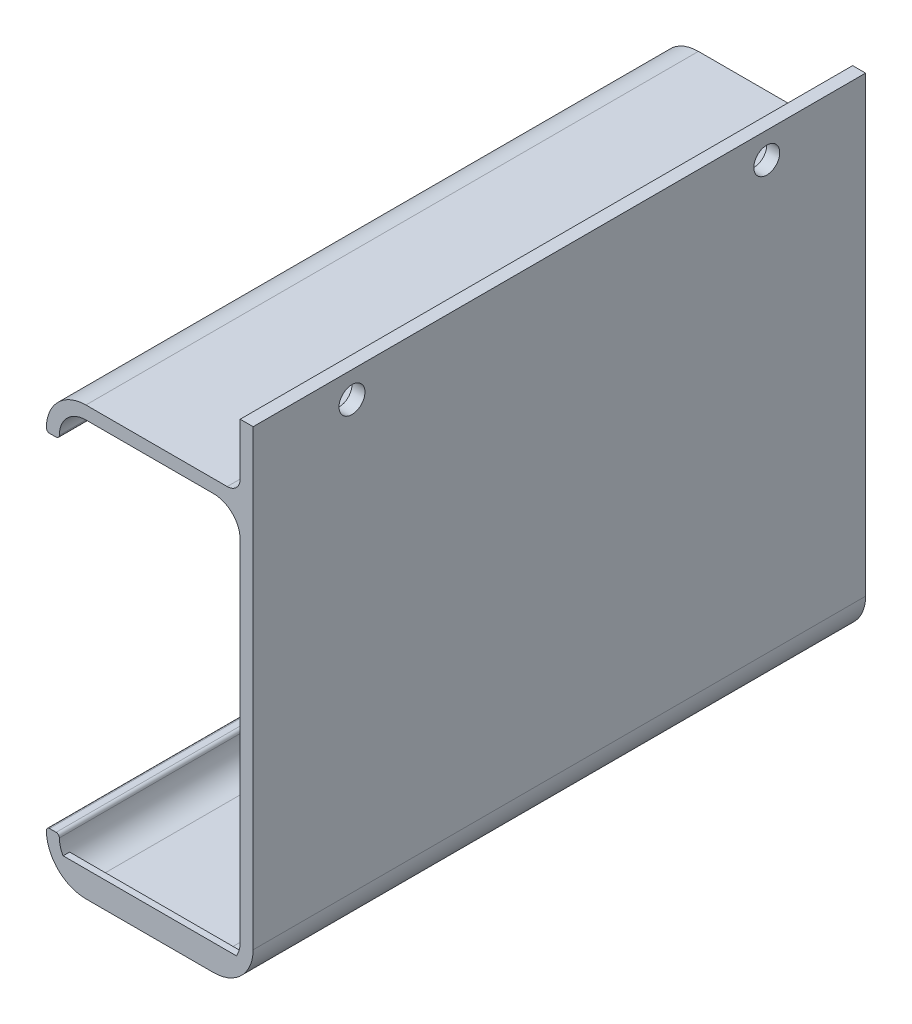
ISO-10303-21;
HEADER;
FILE_DESCRIPTION(('STEP AP214'),'2;1');
FILE_NAME('part.step','',(''),(''),'','','');
FILE_SCHEMA(('AUTOMOTIVE_DESIGN { 1 0 10303 214 1 1 1 1 }'));
ENDSEC;
DATA;
#1=APPLICATION_CONTEXT('core data for automotive mechanical design processes');
#2=APPLICATION_PROTOCOL_DEFINITION('international standard','automotive_design',2000,#1);
#3=PRODUCT_CONTEXT('',#1,'mechanical');
#4=PRODUCT('Part','Part','',(#3));
#5=PRODUCT_RELATED_PRODUCT_CATEGORY('part','',(#4));
#6=PRODUCT_DEFINITION_FORMATION('','',#4);
#7=PRODUCT_DEFINITION_CONTEXT('part definition',#1,'design');
#8=PRODUCT_DEFINITION('design','',#6,#7);
#9=PRODUCT_DEFINITION_SHAPE('','',#8);
#10=(LENGTH_UNIT() NAMED_UNIT(*) SI_UNIT(.MILLI.,.METRE.));
#11=(NAMED_UNIT(*) PLANE_ANGLE_UNIT() SI_UNIT($,.RADIAN.));
#12=(NAMED_UNIT(*) SI_UNIT($,.STERADIAN.) SOLID_ANGLE_UNIT());
#13=UNCERTAINTY_MEASURE_WITH_UNIT(LENGTH_MEASURE(1.E-05),#10,'distance_accuracy_value','');
#14=(GEOMETRIC_REPRESENTATION_CONTEXT(3) GLOBAL_UNCERTAINTY_ASSIGNED_CONTEXT((#13)) GLOBAL_UNIT_ASSIGNED_CONTEXT((#10,
#11,#12)) REPRESENTATION_CONTEXT('',''));
#15=CARTESIAN_POINT('',(0.,0.,0.));
#16=DIRECTION('',(0.,0.,1.));
#17=DIRECTION('',(1.,0.,0.));
#18=AXIS2_PLACEMENT_3D('',#15,#16,#17);
#19=CARTESIAN_POINT('',(-9.85,-26.9,46.25));
#20=DIRECTION('',(0.,0.,-1.));
#21=DIRECTION('',(-1.,0.,0.));
#22=AXIS2_PLACEMENT_3D('',#19,#20,#21);
#23=CYLINDRICAL_SURFACE('',#22,4.09999999999999);
#24=CARTESIAN_POINT('',(-9.85,-26.9,-46.25));
#25=DIRECTION('',(0.,0.,-1.));
#26=DIRECTION('',(-1.,0.,0.));
#27=AXIS2_PLACEMENT_3D('',#24,#25,#26);
#28=CIRCLE('',#27,4.09999999999999);
#29=CARTESIAN_POINT('',(-9.84999999999994,-31.,-46.25));
#30=VERTEX_POINT('',#29);
#31=CARTESIAN_POINT('',(-13.3713633723318,-29.,-46.25));
#32=VERTEX_POINT('',#31);
#33=EDGE_CURVE('E376',#30,#32,#28,.T.);
#34=ORIENTED_EDGE('',*,*,#33,.T.);
#35=DIRECTION('',(0.,0.,1.));
#36=VECTOR('',#35,1.);
#37=CARTESIAN_POINT('',(-13.3713633723318,-29.,-47.25));
#38=LINE('',#37,#36);
#39=CARTESIAN_POINT('',(-13.3713633723318,-29.,-47.25));
#40=VERTEX_POINT('',#39);
#41=EDGE_CURVE('E304',#40,#32,#38,.T.);
#42=ORIENTED_EDGE('',*,*,#41,.F.);
#43=CARTESIAN_POINT('',(-9.85,-26.9,-47.25));
#44=DIRECTION('',(0.,0.,-1.));
#45=DIRECTION('',(1.,0.,0.));
#46=AXIS2_PLACEMENT_3D('',#43,#44,#45);
#47=CIRCLE('',#46,4.09999999999999);
#48=CARTESIAN_POINT('',(-13.95,-26.8999999999999,-47.25));
#49=VERTEX_POINT('',#48);
#50=EDGE_CURVE('E295',#40,#49,#47,.T.);
#51=ORIENTED_EDGE('',*,*,#50,.T.);
#52=DIRECTION('',(0.,0.,-1.));
#53=VECTOR('',#52,1.);
#54=CARTESIAN_POINT('',(-13.95,-26.8999999999999,46.25));
#55=LINE('',#54,#53);
#56=CARTESIAN_POINT('',(-13.95,-26.8999999999999,47.25));
#57=VERTEX_POINT('',#56);
#58=EDGE_CURVE('E421',#57,#49,#55,.T.);
#59=ORIENTED_EDGE('',*,*,#58,.F.);
#60=CARTESIAN_POINT('',(-9.85,-26.9,47.25));
#61=DIRECTION('',(0.,0.,-1.));
#62=DIRECTION('',(1.,0.,0.));
#63=AXIS2_PLACEMENT_3D('',#60,#61,#62);
#64=CIRCLE('',#63,4.09999999999999);
#65=CARTESIAN_POINT('',(-13.3713633723318,-29.,47.25));
#66=VERTEX_POINT('',#65);
#67=EDGE_CURVE('E310',#66,#57,#64,.T.);
#68=ORIENTED_EDGE('',*,*,#67,.F.);
#69=DIRECTION('',(0.,0.,-1.));
#70=VECTOR('',#69,1.);
#71=CARTESIAN_POINT('',(-13.3713633723318,-29.,47.25));
#72=LINE('',#71,#70);
#73=CARTESIAN_POINT('',(-13.3713633723318,-29.,46.25));
#74=VERTEX_POINT('',#73);
#75=EDGE_CURVE('E369',#66,#74,#72,.T.);
#76=ORIENTED_EDGE('',*,*,#75,.T.);
#77=CARTESIAN_POINT('',(-9.85,-26.9,46.25));
#78=DIRECTION('',(0.,0.,-1.));
#79=DIRECTION('',(-1.,0.,0.));
#80=AXIS2_PLACEMENT_3D('',#77,#78,#79);
#81=CIRCLE('',#80,4.09999999999999);
#82=CARTESIAN_POINT('',(-9.84999999999994,-31.,46.25));
#83=VERTEX_POINT('',#82);
#84=EDGE_CURVE('E54',#83,#74,#81,.T.);
#85=ORIENTED_EDGE('',*,*,#84,.F.);
#86=DIRECTION('',(0.,0.,-1.));
#87=VECTOR('',#86,1.);
#88=CARTESIAN_POINT('',(-9.84999999999994,-31.,46.25));
#89=LINE('',#88,#87);
#90=EDGE_CURVE('E382',#83,#30,#89,.T.);
#91=ORIENTED_EDGE('',*,*,#90,.T.);
#92=EDGE_LOOP('',(#34,#42,#51,#59,#68,#76,#85,#91));
#93=FACE_BOUND('',#92,.T.);
#94=ADVANCED_FACE('F39',(#93),#23,.F.);
#95=CARTESIAN_POINT('',(-15.95,-26.4,46.25));
#96=DIRECTION('',(0.,-1.,0.));
#97=DIRECTION('',(0.,0.,-1.));
#98=AXIS2_PLACEMENT_3D('',#95,#96,#97);
#99=PLANE('',#98);
#100=DIRECTION('',(0.,0.,-1.));
#101=VECTOR('',#100,1.);
#102=CARTESIAN_POINT('',(-15.45,-26.4,46.25));
#103=LINE('',#102,#101);
#104=CARTESIAN_POINT('',(-15.45,-26.4,-47.25));
#105=VERTEX_POINT('',#104);
#106=CARTESIAN_POINT('',(-15.45,-26.4,47.25));
#107=VERTEX_POINT('',#106);
#108=EDGE_CURVE('E47',#105,#107,#103,.F.);
#109=ORIENTED_EDGE('',*,*,#108,.T.);
#110=DIRECTION('',(-1.,0.,0.));
#111=VECTOR('',#110,1.);
#112=CARTESIAN_POINT('',(-14.45,-26.4,47.25));
#113=LINE('',#112,#111);
#114=CARTESIAN_POINT('',(-14.45,-26.4,47.25));
#115=VERTEX_POINT('',#114);
#116=EDGE_CURVE('E316',#115,#107,#113,.T.);
#117=ORIENTED_EDGE('',*,*,#116,.F.);
#118=DIRECTION('',(0.,0.,-1.));
#119=VECTOR('',#118,1.);
#120=CARTESIAN_POINT('',(-14.45,-26.4,46.25));
#121=LINE('',#120,#119);
#122=CARTESIAN_POINT('',(-14.45,-26.4,-47.25));
#123=VERTEX_POINT('',#122);
#124=EDGE_CURVE('E11',#115,#123,#121,.T.);
#125=ORIENTED_EDGE('',*,*,#124,.T.);
#126=DIRECTION('',(-1.,0.,0.));
#127=VECTOR('',#126,1.);
#128=CARTESIAN_POINT('',(-14.45,-26.4,-47.25));
#129=LINE('',#128,#127);
#130=EDGE_CURVE('E289',#123,#105,#129,.T.);
#131=ORIENTED_EDGE('',*,*,#130,.T.);
#132=EDGE_LOOP('',(#109,#117,#125,#131));
#133=FACE_BOUND('',#132,.T.);
#134=ADVANCED_FACE('F428',(#133),#99,.F.);
#135=CARTESIAN_POINT('',(-9.85,-26.9,46.25));
#136=DIRECTION('',(0.,0.,-1.));
#137=DIRECTION('',(-1.,0.,0.));
#138=AXIS2_PLACEMENT_3D('',#135,#136,#137);
#139=CYLINDRICAL_SURFACE('',#138,6.1);
#140=DIRECTION('',(0.,0.,-1.));
#141=VECTOR('',#140,1.);
#142=CARTESIAN_POINT('',(-15.95,-26.8999999999999,46.25));
#143=LINE('',#142,#141);
#144=CARTESIAN_POINT('',(-15.95,-26.8999999999999,47.25));
#145=VERTEX_POINT('',#144);
#146=CARTESIAN_POINT('',(-15.95,-26.8999999999999,-47.25));
#147=VERTEX_POINT('',#146);
#148=EDGE_CURVE('E419',#145,#147,#143,.T.);
#149=ORIENTED_EDGE('',*,*,#148,.T.);
#150=CARTESIAN_POINT('',(-9.85,-26.9,-47.25));
#151=DIRECTION('',(0.,0.,1.));
#152=DIRECTION('',(1.,0.,0.));
#153=AXIS2_PLACEMENT_3D('',#150,#151,#152);
#154=CIRCLE('',#153,6.1);
#155=CARTESIAN_POINT('',(-9.84999999999994,-33.,-47.25));
#156=VERTEX_POINT('',#155);
#157=EDGE_CURVE('E283',#147,#156,#154,.T.);
#158=ORIENTED_EDGE('',*,*,#157,.T.);
#159=DIRECTION('',(0.,0.,-1.));
#160=VECTOR('',#159,1.);
#161=CARTESIAN_POINT('',(-9.84999999999994,-33.,46.25));
#162=LINE('',#161,#160);
#163=CARTESIAN_POINT('',(-9.84999999999994,-33.,47.25));
#164=VERTEX_POINT('',#163);
#165=EDGE_CURVE('E417',#164,#156,#162,.T.);
#166=ORIENTED_EDGE('',*,*,#165,.F.);
#167=CARTESIAN_POINT('',(-9.85,-26.9,47.25));
#168=DIRECTION('',(0.,0.,1.));
#169=DIRECTION('',(1.,0.,0.));
#170=AXIS2_PLACEMENT_3D('',#167,#168,#169);
#171=CIRCLE('',#170,6.1);
#172=EDGE_CURVE('E322',#145,#164,#171,.T.);
#173=ORIENTED_EDGE('',*,*,#172,.F.);
#174=EDGE_LOOP('',(#149,#158,#166,#173));
#175=FACE_BOUND('',#174,.T.);
#176=ADVANCED_FACE('F439',(#175),#139,.T.);
#177=CARTESIAN_POINT('',(9.84999999999991,-33.,46.25));
#178=DIRECTION('',(0.,1.,0.));
#179=DIRECTION('',(0.,0.,1.));
#180=AXIS2_PLACEMENT_3D('',#177,#178,#179);
#181=PLANE('',#180);
#182=ORIENTED_EDGE('',*,*,#165,.T.);
#183=DIRECTION('',(1.,0.,0.));
#184=VECTOR('',#183,1.);
#185=CARTESIAN_POINT('',(-9.84999999999994,-33.,-47.25));
#186=LINE('',#185,#184);
#187=CARTESIAN_POINT('',(9.84999999999991,-33.,-47.25));
#188=VERTEX_POINT('',#187);
#189=EDGE_CURVE('E280',#156,#188,#186,.T.);
#190=ORIENTED_EDGE('',*,*,#189,.T.);
#191=DIRECTION('',(0.,0.,-1.));
#192=VECTOR('',#191,1.);
#193=CARTESIAN_POINT('',(9.84999999999991,-33.,46.25));
#194=LINE('',#193,#192);
#195=CARTESIAN_POINT('',(9.84999999999991,-33.,47.25));
#196=VERTEX_POINT('',#195);
#197=EDGE_CURVE('E415',#196,#188,#194,.T.);
#198=ORIENTED_EDGE('',*,*,#197,.F.);
#199=DIRECTION('',(1.,0.,0.));
#200=VECTOR('',#199,1.);
#201=CARTESIAN_POINT('',(-9.84999999999994,-33.,47.25));
#202=LINE('',#201,#200);
#203=EDGE_CURVE('E325',#164,#196,#202,.T.);
#204=ORIENTED_EDGE('',*,*,#203,.F.);
#205=EDGE_LOOP('',(#182,#190,#198,#204));
#206=FACE_BOUND('',#205,.T.);
#207=ADVANCED_FACE('F444',(#206),#181,.F.);
#208=CARTESIAN_POINT('',(9.85,-26.9,46.25));
#209=DIRECTION('',(0.,0.,-1.));
#210=DIRECTION('',(-1.,0.,0.));
#211=AXIS2_PLACEMENT_3D('',#208,#209,#210);
#212=CYLINDRICAL_SURFACE('',#211,6.1);
#213=ORIENTED_EDGE('',*,*,#197,.T.);
#214=CARTESIAN_POINT('',(9.85,-26.9,-47.25));
#215=DIRECTION('',(0.,0.,1.));
#216=DIRECTION('',(1.,0.,0.));
#217=AXIS2_PLACEMENT_3D('',#214,#215,#216);
#218=CIRCLE('',#217,6.1);
#219=CARTESIAN_POINT('',(15.95,-26.9,-47.25));
#220=VERTEX_POINT('',#219);
#221=EDGE_CURVE('E277',#188,#220,#218,.T.);
#222=ORIENTED_EDGE('',*,*,#221,.T.);
#223=DIRECTION('',(0.,0.,-1.));
#224=VECTOR('',#223,1.);
#225=CARTESIAN_POINT('',(15.95,-26.8999999999999,46.25));
#226=LINE('',#225,#224);
#227=CARTESIAN_POINT('',(15.95,-26.9,47.25));
#228=VERTEX_POINT('',#227);
#229=EDGE_CURVE('E413',#228,#220,#226,.T.);
#230=ORIENTED_EDGE('',*,*,#229,.F.);
#231=CARTESIAN_POINT('',(9.85,-26.9,47.25));
#232=DIRECTION('',(0.,0.,1.));
#233=DIRECTION('',(1.,0.,0.));
#234=AXIS2_PLACEMENT_3D('',#231,#232,#233);
#235=CIRCLE('',#234,6.1);
#236=EDGE_CURVE('E328',#196,#228,#235,.T.);
#237=ORIENTED_EDGE('',*,*,#236,.F.);
#238=EDGE_LOOP('',(#213,#222,#230,#237));
#239=FACE_BOUND('',#238,.T.);
#240=ADVANCED_FACE('F449',(#239),#212,.T.);
#241=CARTESIAN_POINT('',(15.95,26.8999999999999,46.25));
#242=DIRECTION('',(-1.,0.,0.));
#243=DIRECTION('',(0.,0.,1.));
#244=AXIS2_PLACEMENT_3D('',#241,#242,#243);
#245=PLANE('',#244);
#246=CARTESIAN_POINT('',(15.95,39.,32.));
#247=DIRECTION('',(-1.,0.,0.));
#248=DIRECTION('',(0.,0.,1.));
#249=AXIS2_PLACEMENT_3D('',#246,#247,#248);
#250=CIRCLE('',#249,2.);
#251=CARTESIAN_POINT('',(15.95,39.,34.));
#252=VERTEX_POINT('',#251);
#253=EDGE_CURVE('E302',#252,#252,#250,.T.);
#254=ORIENTED_EDGE('',*,*,#253,.T.);
#255=EDGE_LOOP('',(#254));
#256=FACE_BOUND('',#255,.T.);
#257=CARTESIAN_POINT('',(15.95,39.,-32.));
#258=DIRECTION('',(-1.,0.,0.));
#259=DIRECTION('',(0.,0.,1.));
#260=AXIS2_PLACEMENT_3D('',#257,#258,#259);
#261=CIRCLE('',#260,2.);
#262=CARTESIAN_POINT('',(15.95,39.,-30.));
#263=VERTEX_POINT('',#262);
#264=EDGE_CURVE('E643',#263,#263,#261,.T.);
#265=ORIENTED_EDGE('',*,*,#264,.T.);
#266=EDGE_LOOP('',(#265));
#267=FACE_BOUND('',#266,.T.);
#268=ORIENTED_EDGE('',*,*,#229,.T.);
#269=DIRECTION('',(0.,1.,0.));
#270=VECTOR('',#269,1.);
#271=CARTESIAN_POINT('',(15.95,-26.9,-47.25));
#272=LINE('',#271,#270);
#273=CARTESIAN_POINT('',(15.95,43.,-47.25));
#274=VERTEX_POINT('',#273);
#275=EDGE_CURVE('E274',#220,#274,#272,.T.);
#276=ORIENTED_EDGE('',*,*,#275,.T.);
#277=DIRECTION('',(0.,0.,-1.));
#278=VECTOR('',#277,1.);
#279=CARTESIAN_POINT('',(15.95,43.,46.25));
#280=LINE('',#279,#278);
#281=CARTESIAN_POINT('',(15.95,43.,47.25));
#282=VERTEX_POINT('',#281);
#283=EDGE_CURVE('E411',#282,#274,#280,.T.);
#284=ORIENTED_EDGE('',*,*,#283,.F.);
#285=DIRECTION('',(0.,1.,0.));
#286=VECTOR('',#285,1.);
#287=CARTESIAN_POINT('',(15.95,-26.9,47.25));
#288=LINE('',#287,#286);
#289=EDGE_CURVE('E331',#228,#282,#288,.T.);
#290=ORIENTED_EDGE('',*,*,#289,.F.);
#291=EDGE_LOOP('',(#268,#276,#284,#290));
#292=FACE_BOUND('',#291,.T.);
#293=ADVANCED_FACE('F451',(#256,#267,#292),#245,.F.);
#294=CARTESIAN_POINT('',(13.95,43.,46.25));
#295=DIRECTION('',(0.,-1.,0.));
#296=DIRECTION('',(1.,0.,0.));
#297=AXIS2_PLACEMENT_3D('',#294,#295,#296);
#298=PLANE('',#297);
#299=ORIENTED_EDGE('',*,*,#283,.T.);
#300=DIRECTION('',(-1.,0.,0.));
#301=VECTOR('',#300,1.);
#302=CARTESIAN_POINT('',(15.95,43.,-47.25));
#303=LINE('',#302,#301);
#304=CARTESIAN_POINT('',(13.95,43.,-47.25));
#305=VERTEX_POINT('',#304);
#306=EDGE_CURVE('E271',#274,#305,#303,.T.);
#307=ORIENTED_EDGE('',*,*,#306,.T.);
#308=DIRECTION('',(0.,0.,-1.));
#309=VECTOR('',#308,1.);
#310=CARTESIAN_POINT('',(13.95,43.,46.25));
#311=LINE('',#310,#309);
#312=CARTESIAN_POINT('',(13.95,43.,47.25));
#313=VERTEX_POINT('',#312);
#314=EDGE_CURVE('E409',#313,#305,#311,.T.);
#315=ORIENTED_EDGE('',*,*,#314,.F.);
#316=DIRECTION('',(-1.,0.,0.));
#317=VECTOR('',#316,1.);
#318=CARTESIAN_POINT('',(15.95,43.,47.25));
#319=LINE('',#318,#317);
#320=EDGE_CURVE('E334',#282,#313,#319,.T.);
#321=ORIENTED_EDGE('',*,*,#320,.F.);
#322=EDGE_LOOP('',(#299,#307,#315,#321));
#323=FACE_BOUND('',#322,.T.);
#324=ADVANCED_FACE('F456',(#323),#298,.F.);
#325=CARTESIAN_POINT('',(13.95,35.,46.25));
#326=DIRECTION('',(1.,0.,0.));
#327=DIRECTION('',(0.,0.,-1.));
#328=AXIS2_PLACEMENT_3D('',#325,#326,#327);
#329=PLANE('',#328);
#330=CARTESIAN_POINT('',(13.95,39.,32.));
#331=DIRECTION('',(-1.,0.,0.));
#332=DIRECTION('',(0.,0.,1.));
#333=AXIS2_PLACEMENT_3D('',#330,#331,#332);
#334=CIRCLE('',#333,2.);
#335=CARTESIAN_POINT('',(13.95,39.,34.));
#336=VERTEX_POINT('',#335);
#337=EDGE_CURVE('E639',#336,#336,#334,.T.);
#338=ORIENTED_EDGE('',*,*,#337,.F.);
#339=EDGE_LOOP('',(#338));
#340=FACE_BOUND('',#339,.T.);
#341=CARTESIAN_POINT('',(13.95,39.,-32.));
#342=DIRECTION('',(-1.,0.,0.));
#343=DIRECTION('',(0.,0.,-1.));
#344=AXIS2_PLACEMENT_3D('',#341,#342,#343);
#345=CIRCLE('',#344,2.);
#346=CARTESIAN_POINT('',(13.95,39.,-34.));
#347=VERTEX_POINT('',#346);
#348=EDGE_CURVE('E647',#347,#347,#345,.T.);
#349=ORIENTED_EDGE('',*,*,#348,.F.);
#350=EDGE_LOOP('',(#349));
#351=FACE_BOUND('',#350,.T.);
#352=ORIENTED_EDGE('',*,*,#314,.T.);
#353=DIRECTION('',(0.,-1.,0.));
#354=VECTOR('',#353,1.);
#355=CARTESIAN_POINT('',(13.95,43.,-47.25));
#356=LINE('',#355,#354);
#357=CARTESIAN_POINT('',(13.95,35.,-47.25));
#358=VERTEX_POINT('',#357);
#359=EDGE_CURVE('E268',#305,#358,#356,.T.);
#360=ORIENTED_EDGE('',*,*,#359,.T.);
#361=DIRECTION('',(0.,0.,-1.));
#362=VECTOR('',#361,1.);
#363=CARTESIAN_POINT('',(13.95,35.,46.25));
#364=LINE('',#363,#362);
#365=CARTESIAN_POINT('',(13.95,35.,47.25));
#366=VERTEX_POINT('',#365);
#367=EDGE_CURVE('E407',#366,#358,#364,.T.);
#368=ORIENTED_EDGE('',*,*,#367,.F.);
#369=DIRECTION('',(0.,-1.,0.));
#370=VECTOR('',#369,1.);
#371=CARTESIAN_POINT('',(13.95,43.,47.25));
#372=LINE('',#371,#370);
#373=EDGE_CURVE('E337',#313,#366,#372,.T.);
#374=ORIENTED_EDGE('',*,*,#373,.F.);
#375=EDGE_LOOP('',(#352,#360,#368,#374));
#376=FACE_BOUND('',#375,.T.);
#377=ADVANCED_FACE('F461',(#340,#351,#376),#329,.F.);
#378=CARTESIAN_POINT('',(11.95,35.,46.25));
#379=DIRECTION('',(0.,0.,-1.));
#380=DIRECTION('',(-1.,0.,0.));
#381=AXIS2_PLACEMENT_3D('',#378,#379,#380);
#382=CYLINDRICAL_SURFACE('',#381,2.);
#383=ORIENTED_EDGE('',*,*,#367,.T.);
#384=CARTESIAN_POINT('',(11.95,35.,-47.25));
#385=DIRECTION('',(0.,0.,-1.));
#386=DIRECTION('',(1.,0.,0.));
#387=AXIS2_PLACEMENT_3D('',#384,#385,#386);
#388=CIRCLE('',#387,2.);
#389=CARTESIAN_POINT('',(11.95,33.,-47.25));
#390=VERTEX_POINT('',#389);
#391=EDGE_CURVE('E265',#358,#390,#388,.T.);
#392=ORIENTED_EDGE('',*,*,#391,.T.);
#393=DIRECTION('',(0.,0.,-1.));
#394=VECTOR('',#393,1.);
#395=CARTESIAN_POINT('',(11.95,33.,46.25));
#396=LINE('',#395,#394);
#397=CARTESIAN_POINT('',(11.95,33.,47.25));
#398=VERTEX_POINT('',#397);
#399=EDGE_CURVE('E405',#398,#390,#396,.T.);
#400=ORIENTED_EDGE('',*,*,#399,.F.);
#401=CARTESIAN_POINT('',(11.95,35.,47.25));
#402=DIRECTION('',(0.,0.,-1.));
#403=DIRECTION('',(1.,0.,0.));
#404=AXIS2_PLACEMENT_3D('',#401,#402,#403);
#405=CIRCLE('',#404,2.);
#406=EDGE_CURVE('E340',#366,#398,#405,.T.);
#407=ORIENTED_EDGE('',*,*,#406,.F.);
#408=EDGE_LOOP('',(#383,#392,#400,#407));
#409=FACE_BOUND('',#408,.T.);
#410=ADVANCED_FACE('F463',(#409),#382,.F.);
#411=CARTESIAN_POINT('',(9.84999999999994,33.,46.25));
#412=DIRECTION('',(0.,-1.,0.));
#413=DIRECTION('',(0.,0.,-1.));
#414=AXIS2_PLACEMENT_3D('',#411,#412,#413);
#415=PLANE('',#414);
#416=ORIENTED_EDGE('',*,*,#399,.T.);
#417=DIRECTION('',(-1.,0.,0.));
#418=VECTOR('',#417,1.);
#419=CARTESIAN_POINT('',(11.95,33.,-47.25));
#420=LINE('',#419,#418);
#421=CARTESIAN_POINT('',(-9.84999999999992,33.,-47.25));
#422=VERTEX_POINT('',#421);
#423=EDGE_CURVE('E262',#390,#422,#420,.T.);
#424=ORIENTED_EDGE('',*,*,#423,.T.);
#425=DIRECTION('',(0.,0.,-1.));
#426=VECTOR('',#425,1.);
#427=CARTESIAN_POINT('',(-9.84999999999992,33.,46.25));
#428=LINE('',#427,#426);
#429=CARTESIAN_POINT('',(-9.84999999999992,33.,47.25));
#430=VERTEX_POINT('',#429);
#431=EDGE_CURVE('E403',#430,#422,#428,.T.);
#432=ORIENTED_EDGE('',*,*,#431,.F.);
#433=DIRECTION('',(-1.,0.,0.));
#434=VECTOR('',#433,1.);
#435=CARTESIAN_POINT('',(11.95,33.,47.25));
#436=LINE('',#435,#434);
#437=EDGE_CURVE('E343',#398,#430,#436,.T.);
#438=ORIENTED_EDGE('',*,*,#437,.F.);
#439=EDGE_LOOP('',(#416,#424,#432,#438));
#440=FACE_BOUND('',#439,.T.);
#441=ADVANCED_FACE('F468',(#440),#415,.F.);
#442=CARTESIAN_POINT('',(-9.85,26.9,46.25));
#443=DIRECTION('',(0.,0.,-1.));
#444=DIRECTION('',(-1.,0.,0.));
#445=AXIS2_PLACEMENT_3D('',#442,#443,#444);
#446=CYLINDRICAL_SURFACE('',#445,6.1);
#447=ORIENTED_EDGE('',*,*,#431,.T.);
#448=CARTESIAN_POINT('',(-9.85,26.9,-47.25));
#449=DIRECTION('',(0.,0.,1.));
#450=DIRECTION('',(1.,0.,0.));
#451=AXIS2_PLACEMENT_3D('',#448,#449,#450);
#452=CIRCLE('',#451,6.1);
#453=CARTESIAN_POINT('',(-15.95,26.9,-47.25));
#454=VERTEX_POINT('',#453);
#455=EDGE_CURVE('E259',#422,#454,#452,.T.);
#456=ORIENTED_EDGE('',*,*,#455,.T.);
#457=DIRECTION('',(0.,0.,-1.));
#458=VECTOR('',#457,1.);
#459=CARTESIAN_POINT('',(-15.95,26.9,46.25));
#460=LINE('',#459,#458);
#461=CARTESIAN_POINT('',(-15.95,26.9,47.25));
#462=VERTEX_POINT('',#461);
#463=EDGE_CURVE('E401',#462,#454,#460,.T.);
#464=ORIENTED_EDGE('',*,*,#463,.F.);
#465=CARTESIAN_POINT('',(-9.85,26.9,47.25));
#466=DIRECTION('',(0.,0.,1.));
#467=DIRECTION('',(1.,0.,0.));
#468=AXIS2_PLACEMENT_3D('',#465,#466,#467);
#469=CIRCLE('',#468,6.1);
#470=EDGE_CURVE('E346',#430,#462,#469,.T.);
#471=ORIENTED_EDGE('',*,*,#470,.F.);
#472=EDGE_LOOP('',(#447,#456,#464,#471));
#473=FACE_BOUND('',#472,.T.);
#474=ADVANCED_FACE('F473',(#473),#446,.T.);
#475=CARTESIAN_POINT('',(-15.95,26.4,46.25));
#476=DIRECTION('',(0.,1.,0.));
#477=DIRECTION('',(0.,0.,1.));
#478=AXIS2_PLACEMENT_3D('',#475,#476,#477);
#479=PLANE('',#478);
#480=DIRECTION('',(0.,0.,-1.));
#481=VECTOR('',#480,1.);
#482=CARTESIAN_POINT('',(-14.45,26.4,46.25));
#483=LINE('',#482,#481);
#484=CARTESIAN_POINT('',(-14.45,26.4,-47.25));
#485=VERTEX_POINT('',#484);
#486=CARTESIAN_POINT('',(-14.45,26.4,47.25));
#487=VERTEX_POINT('',#486);
#488=EDGE_CURVE('E423',#485,#487,#483,.F.);
#489=ORIENTED_EDGE('',*,*,#488,.T.);
#490=DIRECTION('',(1.,0.,0.));
#491=VECTOR('',#490,1.);
#492=CARTESIAN_POINT('',(-15.45,26.4,47.25));
#493=LINE('',#492,#491);
#494=CARTESIAN_POINT('',(-15.45,26.4,47.25));
#495=VERTEX_POINT('',#494);
#496=EDGE_CURVE('E352',#495,#487,#493,.T.);
#497=ORIENTED_EDGE('',*,*,#496,.F.);
#498=DIRECTION('',(0.,0.,-1.));
#499=VECTOR('',#498,1.);
#500=CARTESIAN_POINT('',(-15.45,26.4,46.25));
#501=LINE('',#500,#499);
#502=CARTESIAN_POINT('',(-15.45,26.4,-47.25));
#503=VERTEX_POINT('',#502);
#504=EDGE_CURVE('E425',#495,#503,#501,.T.);
#505=ORIENTED_EDGE('',*,*,#504,.T.);
#506=DIRECTION('',(1.,0.,0.));
#507=VECTOR('',#506,1.);
#508=CARTESIAN_POINT('',(-15.45,26.4,-47.25));
#509=LINE('',#508,#507);
#510=EDGE_CURVE('E253',#503,#485,#509,.T.);
#511=ORIENTED_EDGE('',*,*,#510,.T.);
#512=EDGE_LOOP('',(#489,#497,#505,#511));
#513=FACE_BOUND('',#512,.T.);
#514=ADVANCED_FACE('F480',(#513),#479,.F.);
#515=CARTESIAN_POINT('',(-9.85,26.9,46.25));
#516=DIRECTION('',(0.,0.,-1.));
#517=DIRECTION('',(-1.,0.,0.));
#518=AXIS2_PLACEMENT_3D('',#515,#516,#517);
#519=CYLINDRICAL_SURFACE('',#518,4.09999999999999);
#520=DIRECTION('',(0.,0.,-1.));
#521=VECTOR('',#520,1.);
#522=CARTESIAN_POINT('',(-13.95,26.9,46.25));
#523=LINE('',#522,#521);
#524=CARTESIAN_POINT('',(-13.95,26.9,47.25));
#525=VERTEX_POINT('',#524);
#526=CARTESIAN_POINT('',(-13.95,26.9,-47.25));
#527=VERTEX_POINT('',#526);
#528=EDGE_CURVE('E399',#525,#527,#523,.T.);
#529=ORIENTED_EDGE('',*,*,#528,.T.);
#530=CARTESIAN_POINT('',(-9.85,26.9,-47.25));
#531=DIRECTION('',(0.,0.,-1.));
#532=DIRECTION('',(1.,0.,0.));
#533=AXIS2_PLACEMENT_3D('',#530,#531,#532);
#534=CIRCLE('',#533,4.1);
#535=CARTESIAN_POINT('',(-9.84999999999995,31.,-47.25));
#536=VERTEX_POINT('',#535);
#537=EDGE_CURVE('E247',#527,#536,#534,.T.);
#538=ORIENTED_EDGE('',*,*,#537,.T.);
#539=DIRECTION('',(0.,0.,-1.));
#540=VECTOR('',#539,1.);
#541=CARTESIAN_POINT('',(-9.84999999999995,31.,46.25));
#542=LINE('',#541,#540);
#543=CARTESIAN_POINT('',(-9.84999999999995,31.,47.25));
#544=VERTEX_POINT('',#543);
#545=EDGE_CURVE('E397',#544,#536,#542,.T.);
#546=ORIENTED_EDGE('',*,*,#545,.F.);
#547=CARTESIAN_POINT('',(-9.85,26.9,47.25));
#548=DIRECTION('',(0.,0.,-1.));
#549=DIRECTION('',(1.,0.,0.));
#550=AXIS2_PLACEMENT_3D('',#547,#548,#549);
#551=CIRCLE('',#550,4.1);
#552=EDGE_CURVE('E358',#525,#544,#551,.T.);
#553=ORIENTED_EDGE('',*,*,#552,.F.);
#554=EDGE_LOOP('',(#529,#538,#546,#553));
#555=FACE_BOUND('',#554,.T.);
#556=ADVANCED_FACE('F487',(#555),#519,.F.);
#557=CARTESIAN_POINT('',(9.84999999999994,31.,46.25));
#558=DIRECTION('',(0.,1.,0.));
#559=DIRECTION('',(-1.,0.,0.));
#560=AXIS2_PLACEMENT_3D('',#557,#558,#559);
#561=PLANE('',#560);
#562=ORIENTED_EDGE('',*,*,#545,.T.);
#563=DIRECTION('',(1.,0.,0.));
#564=VECTOR('',#563,1.);
#565=CARTESIAN_POINT('',(-9.84999999999995,31.,-47.25));
#566=LINE('',#565,#564);
#567=CARTESIAN_POINT('',(9.84999999999994,31.,-47.25));
#568=VERTEX_POINT('',#567);
#569=EDGE_CURVE('E241',#536,#568,#566,.T.);
#570=ORIENTED_EDGE('',*,*,#569,.T.);
#571=DIRECTION('',(0.,0.,-1.));
#572=VECTOR('',#571,1.);
#573=CARTESIAN_POINT('',(9.84999999999994,31.,46.25));
#574=LINE('',#573,#572);
#575=CARTESIAN_POINT('',(9.84999999999994,31.,47.25));
#576=VERTEX_POINT('',#575);
#577=EDGE_CURVE('E395',#576,#568,#574,.T.);
#578=ORIENTED_EDGE('',*,*,#577,.F.);
#579=DIRECTION('',(1.,0.,0.));
#580=VECTOR('',#579,1.);
#581=CARTESIAN_POINT('',(-9.84999999999995,31.,47.25));
#582=LINE('',#581,#580);
#583=EDGE_CURVE('E361',#544,#576,#582,.T.);
#584=ORIENTED_EDGE('',*,*,#583,.F.);
#585=EDGE_LOOP('',(#562,#570,#578,#584));
#586=FACE_BOUND('',#585,.T.);
#587=ADVANCED_FACE('F490',(#586),#561,.F.);
#588=CARTESIAN_POINT('',(9.85,26.9,46.25));
#589=DIRECTION('',(0.,0.,-1.));
#590=DIRECTION('',(-1.,0.,0.));
#591=AXIS2_PLACEMENT_3D('',#588,#589,#590);
#592=CYLINDRICAL_SURFACE('',#591,4.10000000000001);
#593=ORIENTED_EDGE('',*,*,#577,.T.);
#594=CARTESIAN_POINT('',(9.85,26.9,-47.25));
#595=DIRECTION('',(0.,0.,-1.));
#596=DIRECTION('',(1.,0.,0.));
#597=AXIS2_PLACEMENT_3D('',#594,#595,#596);
#598=CIRCLE('',#597,4.10000000000001);
#599=CARTESIAN_POINT('',(13.95,26.8999999999999,-47.25));
#600=VERTEX_POINT('',#599);
#601=EDGE_CURVE('E239',#568,#600,#598,.T.);
#602=ORIENTED_EDGE('',*,*,#601,.T.);
#603=DIRECTION('',(0.,0.,-1.));
#604=VECTOR('',#603,1.);
#605=CARTESIAN_POINT('',(13.95,26.8999999999999,46.25));
#606=LINE('',#605,#604);
#607=CARTESIAN_POINT('',(13.95,26.8999999999999,47.25));
#608=VERTEX_POINT('',#607);
#609=EDGE_CURVE('E224',#608,#600,#606,.T.);
#610=ORIENTED_EDGE('',*,*,#609,.F.);
#611=CARTESIAN_POINT('',(9.85,26.9,47.25));
#612=DIRECTION('',(0.,0.,-1.));
#613=DIRECTION('',(1.,0.,0.));
#614=AXIS2_PLACEMENT_3D('',#611,#612,#613);
#615=CIRCLE('',#614,4.10000000000001);
#616=EDGE_CURVE('E364',#576,#608,#615,.T.);
#617=ORIENTED_EDGE('',*,*,#616,.F.);
#618=EDGE_LOOP('',(#593,#602,#610,#617));
#619=FACE_BOUND('',#618,.T.);
#620=ADVANCED_FACE('F494',(#619),#592,.F.);
#621=CARTESIAN_POINT('',(13.95,-26.8999999999999,46.25));
#622=DIRECTION('',(1.,0.,0.));
#623=DIRECTION('',(0.,1.,0.));
#624=AXIS2_PLACEMENT_3D('',#621,#622,#623);
#625=PLANE('',#624);
#626=ORIENTED_EDGE('',*,*,#609,.T.);
#627=DIRECTION('',(0.,-1.,0.));
#628=VECTOR('',#627,1.);
#629=CARTESIAN_POINT('',(13.95,26.8999999999999,-47.25));
#630=LINE('',#629,#628);
#631=CARTESIAN_POINT('',(13.95,-26.8999999999999,-47.25));
#632=VERTEX_POINT('',#631);
#633=EDGE_CURVE('E231',#600,#632,#630,.T.);
#634=ORIENTED_EDGE('',*,*,#633,.T.);
#635=DIRECTION('',(0.,0.,-1.));
#636=VECTOR('',#635,1.);
#637=CARTESIAN_POINT('',(13.95,-26.8999999999999,46.25));
#638=LINE('',#637,#636);
#639=CARTESIAN_POINT('',(13.95,-26.8999999999999,47.25));
#640=VERTEX_POINT('',#639);
#641=EDGE_CURVE('E212',#640,#632,#638,.T.);
#642=ORIENTED_EDGE('',*,*,#641,.F.);
#643=DIRECTION('',(0.,-1.,0.));
#644=VECTOR('',#643,1.);
#645=CARTESIAN_POINT('',(13.95,26.8999999999999,47.25));
#646=LINE('',#645,#644);
#647=EDGE_CURVE('E367',#608,#640,#646,.T.);
#648=ORIENTED_EDGE('',*,*,#647,.F.);
#649=EDGE_LOOP('',(#626,#634,#642,#648));
#650=FACE_BOUND('',#649,.T.);
#651=ADVANCED_FACE('F238',(#650),#625,.F.);
#652=CARTESIAN_POINT('',(9.85,-26.9,46.25));
#653=DIRECTION('',(0.,0.,-1.));
#654=DIRECTION('',(-1.,0.,0.));
#655=AXIS2_PLACEMENT_3D('',#652,#653,#654);
#656=CYLINDRICAL_SURFACE('',#655,4.10000000000001);
#657=ORIENTED_EDGE('',*,*,#641,.T.);
#658=CARTESIAN_POINT('',(9.85,-26.9,-47.25));
#659=DIRECTION('',(0.,0.,-1.));
#660=DIRECTION('',(1.,0.,0.));
#661=AXIS2_PLACEMENT_3D('',#658,#659,#660);
#662=CIRCLE('',#661,4.1);
#663=CARTESIAN_POINT('',(13.3713633723318,-29.,-47.25));
#664=VERTEX_POINT('',#663);
#665=EDGE_CURVE('E216',#632,#664,#662,.T.);
#666=ORIENTED_EDGE('',*,*,#665,.T.);
#667=DIRECTION('',(0.,0.,1.));
#668=VECTOR('',#667,1.);
#669=CARTESIAN_POINT('',(13.3713633723318,-29.,-47.25));
#670=LINE('',#669,#668);
#671=CARTESIAN_POINT('',(13.3713633723318,-29.,-46.25));
#672=VERTEX_POINT('',#671);
#673=EDGE_CURVE('E299',#664,#672,#670,.T.);
#674=ORIENTED_EDGE('',*,*,#673,.T.);
#675=CARTESIAN_POINT('',(9.85,-26.9,-46.25));
#676=DIRECTION('',(0.,0.,-1.));
#677=DIRECTION('',(-1.,0.,0.));
#678=AXIS2_PLACEMENT_3D('',#675,#676,#677);
#679=CIRCLE('',#678,4.10000000000001);
#680=CARTESIAN_POINT('',(9.84999999999994,-31.,-46.25));
#681=VERTEX_POINT('',#680);
#682=EDGE_CURVE('E385',#672,#681,#679,.T.);
#683=ORIENTED_EDGE('',*,*,#682,.T.);
#684=DIRECTION('',(0.,0.,-1.));
#685=VECTOR('',#684,1.);
#686=CARTESIAN_POINT('',(9.84999999999994,-31.,46.25));
#687=LINE('',#686,#685);
#688=CARTESIAN_POINT('',(9.84999999999994,-31.,46.25));
#689=VERTEX_POINT('',#688);
#690=EDGE_CURVE('E225',#689,#681,#687,.T.);
#691=ORIENTED_EDGE('',*,*,#690,.F.);
#692=CARTESIAN_POINT('',(9.85,-26.9,46.25));
#693=DIRECTION('',(0.,0.,-1.));
#694=DIRECTION('',(-1.,0.,0.));
#695=AXIS2_PLACEMENT_3D('',#692,#693,#694);
#696=CIRCLE('',#695,4.10000000000001);
#697=CARTESIAN_POINT('',(13.3713633723318,-29.,46.25));
#698=VERTEX_POINT('',#697);
#699=EDGE_CURVE('E62',#698,#689,#696,.T.);
#700=ORIENTED_EDGE('',*,*,#699,.F.);
#701=DIRECTION('',(0.,0.,-1.));
#702=VECTOR('',#701,1.);
#703=CARTESIAN_POINT('',(13.3713633723318,-29.,47.25));
#704=LINE('',#703,#702);
#705=CARTESIAN_POINT('',(13.3713633723318,-29.,47.25));
#706=VERTEX_POINT('',#705);
#707=EDGE_CURVE('E373',#706,#698,#704,.T.);
#708=ORIENTED_EDGE('',*,*,#707,.F.);
#709=CARTESIAN_POINT('',(9.85,-26.9,47.25));
#710=DIRECTION('',(0.,0.,-1.));
#711=DIRECTION('',(1.,0.,0.));
#712=AXIS2_PLACEMENT_3D('',#709,#710,#711);
#713=CIRCLE('',#712,4.1);
#714=EDGE_CURVE('E219',#640,#706,#713,.T.);
#715=ORIENTED_EDGE('',*,*,#714,.F.);
#716=EDGE_LOOP('',(#657,#666,#674,#683,#691,#700,#708,#715));
#717=FACE_BOUND('',#716,.T.);
#718=ADVANCED_FACE('F214',(#717),#656,.F.);
#719=CARTESIAN_POINT('',(9.84999999999994,-31.,46.25));
#720=DIRECTION('',(0.,-1.,0.));
#721=DIRECTION('',(1.,0.,0.));
#722=AXIS2_PLACEMENT_3D('',#719,#720,#721);
#723=PLANE('',#722);
#724=DIRECTION('',(-1.,0.,0.));
#725=VECTOR('',#724,1.);
#726=CARTESIAN_POINT('',(9.84999999999994,-31.,-46.25));
#727=LINE('',#726,#725);
#728=EDGE_CURVE('E378',#681,#30,#727,.T.);
#729=ORIENTED_EDGE('',*,*,#728,.T.);
#730=ORIENTED_EDGE('',*,*,#90,.F.);
#731=DIRECTION('',(-1.,0.,0.));
#732=VECTOR('',#731,1.);
#733=CARTESIAN_POINT('',(9.84999999999994,-31.,46.25));
#734=LINE('',#733,#732);
#735=EDGE_CURVE('E380',#689,#83,#734,.T.);
#736=ORIENTED_EDGE('',*,*,#735,.F.);
#737=ORIENTED_EDGE('',*,*,#690,.T.);
#738=EDGE_LOOP('',(#729,#730,#736,#737));
#739=FACE_BOUND('',#738,.T.);
#740=ADVANCED_FACE('F515',(#739),#723,.F.);
#741=CARTESIAN_POINT('',(-15.45,26.9,46.25));
#742=DIRECTION('',(0.,0.,-1.));
#743=DIRECTION('',(-1.,0.,0.));
#744=AXIS2_PLACEMENT_3D('',#741,#742,#743);
#745=CYLINDRICAL_SURFACE('',#744,0.5);
#746=ORIENTED_EDGE('',*,*,#504,.F.);
#747=CARTESIAN_POINT('',(-15.45,26.9,47.25));
#748=DIRECTION('',(0.,0.,1.));
#749=DIRECTION('',(1.,0.,0.));
#750=AXIS2_PLACEMENT_3D('',#747,#748,#749);
#751=CIRCLE('',#750,0.499999999999997);
#752=EDGE_CURVE('E349',#462,#495,#751,.T.);
#753=ORIENTED_EDGE('',*,*,#752,.F.);
#754=ORIENTED_EDGE('',*,*,#463,.T.);
#755=CARTESIAN_POINT('',(-15.45,26.9,-47.25));
#756=DIRECTION('',(0.,0.,1.));
#757=DIRECTION('',(1.,0.,0.));
#758=AXIS2_PLACEMENT_3D('',#755,#756,#757);
#759=CIRCLE('',#758,0.499999999999997);
#760=EDGE_CURVE('E256',#454,#503,#759,.T.);
#761=ORIENTED_EDGE('',*,*,#760,.T.);
#762=EDGE_LOOP('',(#746,#753,#754,#761));
#763=FACE_BOUND('',#762,.T.);
#764=ADVANCED_FACE('F475',(#763),#745,.T.);
#765=CARTESIAN_POINT('',(-14.45,26.9,46.25));
#766=DIRECTION('',(0.,0.,-1.));
#767=DIRECTION('',(-1.,0.,0.));
#768=AXIS2_PLACEMENT_3D('',#765,#766,#767);
#769=CYLINDRICAL_SURFACE('',#768,0.5);
#770=ORIENTED_EDGE('',*,*,#528,.F.);
#771=CARTESIAN_POINT('',(-14.45,26.9,47.25));
#772=DIRECTION('',(0.,0.,1.));
#773=DIRECTION('',(1.,0.,0.));
#774=AXIS2_PLACEMENT_3D('',#771,#772,#773);
#775=CIRCLE('',#774,0.5);
#776=EDGE_CURVE('E355',#487,#525,#775,.T.);
#777=ORIENTED_EDGE('',*,*,#776,.F.);
#778=ORIENTED_EDGE('',*,*,#488,.F.);
#779=CARTESIAN_POINT('',(-14.45,26.9,-47.25));
#780=DIRECTION('',(0.,0.,1.));
#781=DIRECTION('',(1.,0.,0.));
#782=AXIS2_PLACEMENT_3D('',#779,#780,#781);
#783=CIRCLE('',#782,0.5);
#784=EDGE_CURVE('E250',#485,#527,#783,.T.);
#785=ORIENTED_EDGE('',*,*,#784,.T.);
#786=EDGE_LOOP('',(#770,#777,#778,#785));
#787=FACE_BOUND('',#786,.T.);
#788=ADVANCED_FACE('F485',(#787),#769,.T.);
#789=CARTESIAN_POINT('',(-14.45,-26.9,46.25));
#790=DIRECTION('',(0.,0.,-1.));
#791=DIRECTION('',(-1.,0.,0.));
#792=AXIS2_PLACEMENT_3D('',#789,#790,#791);
#793=CYLINDRICAL_SURFACE('',#792,0.5);
#794=ORIENTED_EDGE('',*,*,#124,.F.);
#795=CARTESIAN_POINT('',(-14.45,-26.9,47.25));
#796=DIRECTION('',(0.,0.,1.));
#797=DIRECTION('',(1.,0.,0.));
#798=AXIS2_PLACEMENT_3D('',#795,#796,#797);
#799=CIRCLE('',#798,0.500000000000005);
#800=EDGE_CURVE('E313',#57,#115,#799,.T.);
#801=ORIENTED_EDGE('',*,*,#800,.F.);
#802=ORIENTED_EDGE('',*,*,#58,.T.);
#803=CARTESIAN_POINT('',(-14.45,-26.9,-47.25));
#804=DIRECTION('',(0.,0.,1.));
#805=DIRECTION('',(1.,0.,0.));
#806=AXIS2_PLACEMENT_3D('',#803,#804,#805);
#807=CIRCLE('',#806,0.500000000000005);
#808=EDGE_CURVE('E292',#49,#123,#807,.T.);
#809=ORIENTED_EDGE('',*,*,#808,.T.);
#810=EDGE_LOOP('',(#794,#801,#802,#809));
#811=FACE_BOUND('',#810,.T.);
#812=ADVANCED_FACE('F517',(#811),#793,.T.);
#813=CARTESIAN_POINT('',(-15.45,-26.9,46.25));
#814=DIRECTION('',(0.,0.,-1.));
#815=DIRECTION('',(-1.,0.,0.));
#816=AXIS2_PLACEMENT_3D('',#813,#814,#815);
#817=CYLINDRICAL_SURFACE('',#816,0.5);
#818=ORIENTED_EDGE('',*,*,#148,.F.);
#819=CARTESIAN_POINT('',(-15.45,-26.9,47.25));
#820=DIRECTION('',(0.,0.,1.));
#821=DIRECTION('',(1.,0.,0.));
#822=AXIS2_PLACEMENT_3D('',#819,#820,#821);
#823=CIRCLE('',#822,0.5);
#824=EDGE_CURVE('E319',#107,#145,#823,.T.);
#825=ORIENTED_EDGE('',*,*,#824,.F.);
#826=ORIENTED_EDGE('',*,*,#108,.F.);
#827=CARTESIAN_POINT('',(-15.45,-26.9,-47.25));
#828=DIRECTION('',(0.,0.,1.));
#829=DIRECTION('',(1.,0.,0.));
#830=AXIS2_PLACEMENT_3D('',#827,#828,#829);
#831=CIRCLE('',#830,0.5);
#832=EDGE_CURVE('E286',#105,#147,#831,.T.);
#833=ORIENTED_EDGE('',*,*,#832,.T.);
#834=EDGE_LOOP('',(#818,#825,#826,#833));
#835=FACE_BOUND('',#834,.T.);
#836=ADVANCED_FACE('F41',(#835),#817,.T.);
#837=CARTESIAN_POINT('',(9.85,-26.9,46.25));
#838=DIRECTION('',(0.,0.,1.));
#839=DIRECTION('',(1.,0.,0.));
#840=AXIS2_PLACEMENT_3D('',#837,#838,#839);
#841=PLANE('',#840);
#842=DIRECTION('',(-1.,0.,0.));
#843=VECTOR('',#842,1.);
#844=CARTESIAN_POINT('',(-13.3713633723318,-29.,46.25));
#845=LINE('',#844,#843);
#846=EDGE_CURVE('E306',#698,#74,#845,.T.);
#847=ORIENTED_EDGE('',*,*,#846,.F.);
#848=ORIENTED_EDGE('',*,*,#699,.T.);
#849=ORIENTED_EDGE('',*,*,#735,.T.);
#850=ORIENTED_EDGE('',*,*,#84,.T.);
#851=EDGE_LOOP('',(#847,#848,#849,#850));
#852=FACE_BOUND('',#851,.T.);
#853=ADVANCED_FACE('F523',(#852),#841,.F.);
#854=CARTESIAN_POINT('',(-13.3713633723318,-29.,47.25));
#855=DIRECTION('',(0.,-1.,0.));
#856=DIRECTION('',(1.,0.,0.));
#857=AXIS2_PLACEMENT_3D('',#854,#855,#856);
#858=PLANE('',#857);
#859=ORIENTED_EDGE('',*,*,#846,.T.);
#860=ORIENTED_EDGE('',*,*,#75,.F.);
#861=DIRECTION('',(-1.,0.,0.));
#862=VECTOR('',#861,1.);
#863=CARTESIAN_POINT('',(-13.3713633723318,-29.,47.25));
#864=LINE('',#863,#862);
#865=EDGE_CURVE('E308',#706,#66,#864,.T.);
#866=ORIENTED_EDGE('',*,*,#865,.F.);
#867=ORIENTED_EDGE('',*,*,#707,.T.);
#868=EDGE_LOOP('',(#859,#860,#866,#867));
#869=FACE_BOUND('',#868,.T.);
#870=ADVANCED_FACE('F535',(#869),#858,.F.);
#871=CARTESIAN_POINT('',(9.85,-26.9,47.25));
#872=DIRECTION('',(0.,0.,1.));
#873=DIRECTION('',(1.,0.,0.));
#874=AXIS2_PLACEMENT_3D('',#871,#872,#873);
#875=PLANE('',#874);
#876=ORIENTED_EDGE('',*,*,#714,.T.);
#877=ORIENTED_EDGE('',*,*,#865,.T.);
#878=ORIENTED_EDGE('',*,*,#67,.T.);
#879=ORIENTED_EDGE('',*,*,#800,.T.);
#880=ORIENTED_EDGE('',*,*,#116,.T.);
#881=ORIENTED_EDGE('',*,*,#824,.T.);
#882=ORIENTED_EDGE('',*,*,#172,.T.);
#883=ORIENTED_EDGE('',*,*,#203,.T.);
#884=ORIENTED_EDGE('',*,*,#236,.T.);
#885=ORIENTED_EDGE('',*,*,#289,.T.);
#886=ORIENTED_EDGE('',*,*,#320,.T.);
#887=ORIENTED_EDGE('',*,*,#373,.T.);
#888=ORIENTED_EDGE('',*,*,#406,.T.);
#889=ORIENTED_EDGE('',*,*,#437,.T.);
#890=ORIENTED_EDGE('',*,*,#470,.T.);
#891=ORIENTED_EDGE('',*,*,#752,.T.);
#892=ORIENTED_EDGE('',*,*,#496,.T.);
#893=ORIENTED_EDGE('',*,*,#776,.T.);
#894=ORIENTED_EDGE('',*,*,#552,.T.);
#895=ORIENTED_EDGE('',*,*,#583,.T.);
#896=ORIENTED_EDGE('',*,*,#616,.T.);
#897=ORIENTED_EDGE('',*,*,#647,.T.);
#898=EDGE_LOOP('',(#876,#877,#878,#879,#880,#881,#882,#883,#884,#885,#886,#887,#888,#889,#890,
#891,#892,#893,#894,#895,#896,#897));
#899=FACE_BOUND('',#898,.T.);
#900=ADVANCED_FACE('F434',(#899),#875,.T.);
#901=CARTESIAN_POINT('',(-13.3713633723318,-29.,-47.25));
#902=DIRECTION('',(0.,1.,0.));
#903=DIRECTION('',(-1.,0.,0.));
#904=AXIS2_PLACEMENT_3D('',#901,#902,#903);
#905=PLANE('',#904);
#906=DIRECTION('',(-1.,0.,0.));
#907=VECTOR('',#906,1.);
#908=CARTESIAN_POINT('',(-13.3713633723318,-29.,-46.25));
#909=LINE('',#908,#907);
#910=EDGE_CURVE('E236',#672,#32,#909,.T.);
#911=ORIENTED_EDGE('',*,*,#910,.F.);
#912=ORIENTED_EDGE('',*,*,#673,.F.);
#913=DIRECTION('',(-1.,0.,0.));
#914=VECTOR('',#913,1.);
#915=CARTESIAN_POINT('',(-13.3713633723318,-29.,-47.25));
#916=LINE('',#915,#914);
#917=EDGE_CURVE('E235',#664,#40,#916,.T.);
#918=ORIENTED_EDGE('',*,*,#917,.T.);
#919=ORIENTED_EDGE('',*,*,#41,.T.);
#920=EDGE_LOOP('',(#911,#912,#918,#919));
#921=FACE_BOUND('',#920,.T.);
#922=ADVANCED_FACE('F528',(#921),#905,.T.);
#923=CARTESIAN_POINT('',(9.85,-26.9,-47.25));
#924=DIRECTION('',(0.,0.,-1.));
#925=DIRECTION('',(1.,0.,0.));
#926=AXIS2_PLACEMENT_3D('',#923,#924,#925);
#927=PLANE('',#926);
#928=ORIENTED_EDGE('',*,*,#665,.F.);
#929=ORIENTED_EDGE('',*,*,#633,.F.);
#930=ORIENTED_EDGE('',*,*,#601,.F.);
#931=ORIENTED_EDGE('',*,*,#569,.F.);
#932=ORIENTED_EDGE('',*,*,#537,.F.);
#933=ORIENTED_EDGE('',*,*,#784,.F.);
#934=ORIENTED_EDGE('',*,*,#510,.F.);
#935=ORIENTED_EDGE('',*,*,#760,.F.);
#936=ORIENTED_EDGE('',*,*,#455,.F.);
#937=ORIENTED_EDGE('',*,*,#423,.F.);
#938=ORIENTED_EDGE('',*,*,#391,.F.);
#939=ORIENTED_EDGE('',*,*,#359,.F.);
#940=ORIENTED_EDGE('',*,*,#306,.F.);
#941=ORIENTED_EDGE('',*,*,#275,.F.);
#942=ORIENTED_EDGE('',*,*,#221,.F.);
#943=ORIENTED_EDGE('',*,*,#189,.F.);
#944=ORIENTED_EDGE('',*,*,#157,.F.);
#945=ORIENTED_EDGE('',*,*,#832,.F.);
#946=ORIENTED_EDGE('',*,*,#130,.F.);
#947=ORIENTED_EDGE('',*,*,#808,.F.);
#948=ORIENTED_EDGE('',*,*,#50,.F.);
#949=ORIENTED_EDGE('',*,*,#917,.F.);
#950=EDGE_LOOP('',(#928,#929,#930,#931,#932,#933,#934,#935,#936,#937,#938,#939,#940,#941,#942,
#943,#944,#945,#946,#947,#948,#949));
#951=FACE_BOUND('',#950,.T.);
#952=ADVANCED_FACE('F229',(#951),#927,.T.);
#953=CARTESIAN_POINT('',(9.85,-26.9,-46.25));
#954=DIRECTION('',(0.,0.,-1.));
#955=DIRECTION('',(1.,0.,0.));
#956=AXIS2_PLACEMENT_3D('',#953,#954,#955);
#957=PLANE('',#956);
#958=ORIENTED_EDGE('',*,*,#33,.F.);
#959=ORIENTED_EDGE('',*,*,#728,.F.);
#960=ORIENTED_EDGE('',*,*,#682,.F.);
#961=ORIENTED_EDGE('',*,*,#910,.T.);
#962=EDGE_LOOP('',(#958,#959,#960,#961));
#963=FACE_BOUND('',#962,.T.);
#964=ADVANCED_FACE('F530',(#963),#957,.F.);
#965=CARTESIAN_POINT('',(34.95,39.,-32.));
#966=DIRECTION('',(-1.,0.,0.));
#967=DIRECTION('',(0.,0.,1.));
#968=AXIS2_PLACEMENT_3D('',#965,#966,#967);
#969=CYLINDRICAL_SURFACE('',#968,2.);
#970=ORIENTED_EDGE('',*,*,#348,.T.);
#971=EDGE_LOOP('',(#970));
#972=FACE_BOUND('',#971,.T.);
#973=ORIENTED_EDGE('',*,*,#264,.F.);
#974=EDGE_LOOP('',(#973));
#975=FACE_BOUND('',#974,.T.);
#976=ADVANCED_FACE('F612',(#972,#975),#969,.F.);
#977=CARTESIAN_POINT('',(34.95,39.,32.));
#978=DIRECTION('',(-1.,0.,0.));
#979=DIRECTION('',(0.,0.,1.));
#980=AXIS2_PLACEMENT_3D('',#977,#978,#979);
#981=CYLINDRICAL_SURFACE('',#980,2.);
#982=ORIENTED_EDGE('',*,*,#337,.T.);
#983=EDGE_LOOP('',(#982));
#984=FACE_BOUND('',#983,.T.);
#985=ORIENTED_EDGE('',*,*,#253,.F.);
#986=EDGE_LOOP('',(#985));
#987=FACE_BOUND('',#986,.T.);
#988=ADVANCED_FACE('F622',(#984,#987),#981,.F.);
#989=CLOSED_SHELL('',(#94,#134,#176,#207,#240,#293,#324,#377,#410,#441,#474,#514,#556,#587,#620,
#651,#718,#740,#764,#788,#812,#836,#853,#870,#900,#922,#952,#964,#976,#988));
#990=MANIFOLD_SOLID_BREP('B2',#989);
#991=ADVANCED_BREP_SHAPE_REPRESENTATION('',(#18,#990),#14);
#992=SHAPE_DEFINITION_REPRESENTATION(#9,#991);
ENDSEC;
END-ISO-10303-21;
